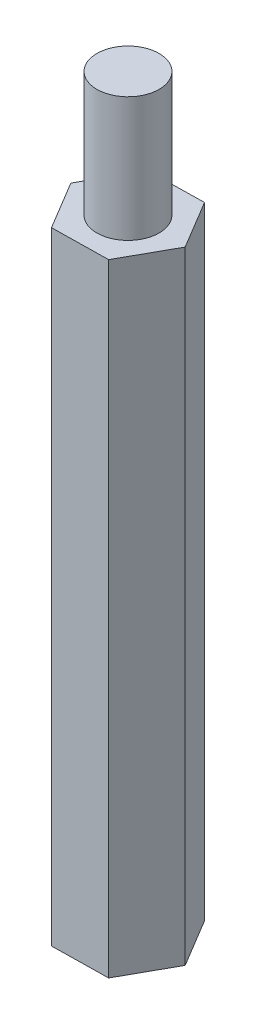
ISO-10303-21;
HEADER;
FILE_DESCRIPTION(('STEP AP214'),'2;1');
FILE_NAME('part.step','',(''),(''),'','','');
FILE_SCHEMA(('AUTOMOTIVE_DESIGN { 1 0 10303 214 1 1 1 1 }'));
ENDSEC;
DATA;
#1=APPLICATION_CONTEXT('core data for automotive mechanical design processes');
#2=APPLICATION_PROTOCOL_DEFINITION('international standard','automotive_design',2000,#1);
#3=PRODUCT_CONTEXT('',#1,'mechanical');
#4=PRODUCT('Part','Part','',(#3));
#5=PRODUCT_RELATED_PRODUCT_CATEGORY('part','',(#4));
#6=PRODUCT_DEFINITION_FORMATION('','',#4);
#7=PRODUCT_DEFINITION_CONTEXT('part definition',#1,'design');
#8=PRODUCT_DEFINITION('design','',#6,#7);
#9=PRODUCT_DEFINITION_SHAPE('','',#8);
#10=(LENGTH_UNIT() NAMED_UNIT(*) SI_UNIT(.MILLI.,.METRE.));
#11=(NAMED_UNIT(*) PLANE_ANGLE_UNIT() SI_UNIT($,.RADIAN.));
#12=(NAMED_UNIT(*) SI_UNIT($,.STERADIAN.) SOLID_ANGLE_UNIT());
#13=UNCERTAINTY_MEASURE_WITH_UNIT(LENGTH_MEASURE(1.E-05),#10,'distance_accuracy_value','');
#14=(GEOMETRIC_REPRESENTATION_CONTEXT(3) GLOBAL_UNCERTAINTY_ASSIGNED_CONTEXT((#13)) GLOBAL_UNIT_ASSIGNED_CONTEXT((#10,
#11,#12)) REPRESENTATION_CONTEXT('',''));
#15=CARTESIAN_POINT('',(0.,0.,0.));
#16=DIRECTION('',(0.,0.,1.));
#17=DIRECTION('',(1.,0.,0.));
#18=AXIS2_PLACEMENT_3D('',#15,#16,#17);
#19=CARTESIAN_POINT('',(0.,36.,0.));
#20=DIRECTION('',(0.,-1.,0.));
#21=DIRECTION('',(0.,0.,-1.));
#22=AXIS2_PLACEMENT_3D('',#19,#20,#21);
#23=CYLINDRICAL_SURFACE('',#22,1.5);
#24=CARTESIAN_POINT('',(0.,36.,0.));
#25=DIRECTION('',(0.,1.,0.));
#26=DIRECTION('',(0.,0.,1.));
#27=AXIS2_PLACEMENT_3D('',#24,#25,#26);
#28=CIRCLE('',#27,1.5);
#29=CARTESIAN_POINT('',(0.,36.,1.5));
#30=VERTEX_POINT('',#29);
#31=EDGE_CURVE('E11',#30,#30,#28,.T.);
#32=ORIENTED_EDGE('',*,*,#31,.F.);
#33=EDGE_LOOP('',(#32));
#34=FACE_BOUND('',#33,.T.);
#35=CARTESIAN_POINT('',(0.,30.,0.));
#36=DIRECTION('',(0.,1.,0.));
#37=DIRECTION('',(0.,0.,1.));
#38=AXIS2_PLACEMENT_3D('',#35,#36,#37);
#39=CIRCLE('',#38,1.5);
#40=CARTESIAN_POINT('',(0.,30.,1.5));
#41=VERTEX_POINT('',#40);
#42=EDGE_CURVE('E46',#41,#41,#39,.T.);
#43=ORIENTED_EDGE('',*,*,#42,.T.);
#44=EDGE_LOOP('',(#43));
#45=FACE_BOUND('',#44,.T.);
#46=ADVANCED_FACE('F43',(#34,#45),#23,.T.);
#47=CARTESIAN_POINT('',(0.,36.,0.));
#48=DIRECTION('',(0.,1.,0.));
#49=DIRECTION('',(0.,0.,1.));
#50=AXIS2_PLACEMENT_3D('',#47,#48,#49);
#51=PLANE('',#50);
#52=ORIENTED_EDGE('',*,*,#31,.T.);
#53=EDGE_LOOP('',(#52));
#54=FACE_BOUND('',#53,.T.);
#55=ADVANCED_FACE('F58',(#54),#51,.T.);
#56=CARTESIAN_POINT('',(0.,30.,0.));
#57=DIRECTION('',(0.,1.,0.));
#58=DIRECTION('',(0.,0.,1.));
#59=AXIS2_PLACEMENT_3D('',#56,#57,#58);
#60=PLANE('',#59);
#61=ORIENTED_EDGE('',*,*,#42,.F.);
#62=EDGE_LOOP('',(#61));
#63=FACE_BOUND('',#62,.T.);
#64=ADVANCED_FACE('F56',(#63),#60,.F.);
#65=CLOSED_SHELL('',(#46,#55,#64));
#66=MANIFOLD_SOLID_BREP('B2',#65);
#67=CARTESIAN_POINT('',(0.,30.,0.));
#68=DIRECTION('',(0.,1.,0.));
#69=DIRECTION('',(0.,0.,1.));
#70=AXIS2_PLACEMENT_3D('',#67,#68,#69);
#71=PLANE('',#70);
#72=DIRECTION('',(0.9998697085006,0.,-0.0161420575803037));
#73=VECTOR('',#72,1.);
#74=CARTESIAN_POINT('',(-1.31866252127611,30.,2.37159492500618));
#75=LINE('',#74,#73);
#76=CARTESIAN_POINT('',(-1.31866252127611,30.,2.37159492500618));
#77=VERTEX_POINT('',#76);
#78=CARTESIAN_POINT('',(1.39453019190354,30.,2.32779270494664));
#79=VERTEX_POINT('',#78);
#80=EDGE_CURVE('E180',#77,#79,#75,.T.);
#81=ORIENTED_EDGE('',*,*,#80,.T.);
#82=DIRECTION('',(0.485955422316405,0.,-0.873983596826213));
#83=VECTOR('',#82,1.);
#84=CARTESIAN_POINT('',(1.39453019190354,30.,2.32779270494664));
#85=LINE('',#84,#83);
#86=CARTESIAN_POINT('',(2.71319271317966,30.,-0.0438022200595355));
#87=VERTEX_POINT('',#86);
#88=EDGE_CURVE('E138',#79,#87,#85,.T.);
#89=ORIENTED_EDGE('',*,*,#88,.T.);
#90=DIRECTION('',(-0.513914286184194,0.,-0.857841539245909));
#91=VECTOR('',#90,1.);
#92=CARTESIAN_POINT('',(2.71319271317966,30.,-0.0438022200595355));
#93=LINE('',#92,#91);
#94=CARTESIAN_POINT('',(1.31866252127611,30.,-2.37159492500618));
#95=VERTEX_POINT('',#94);
#96=EDGE_CURVE('E151',#87,#95,#93,.T.);
#97=ORIENTED_EDGE('',*,*,#96,.T.);
#98=DIRECTION('',(-0.9998697085006,0.,0.0161420575803037));
#99=VECTOR('',#98,1.);
#100=CARTESIAN_POINT('',(1.31866252127611,30.,-2.37159492500618));
#101=LINE('',#100,#99);
#102=CARTESIAN_POINT('',(-1.39453019190354,30.,-2.32779270494664));
#103=VERTEX_POINT('',#102);
#104=EDGE_CURVE('E145',#95,#103,#101,.T.);
#105=ORIENTED_EDGE('',*,*,#104,.T.);
#106=DIRECTION('',(-0.485955422316406,0.,0.873983596826213));
#107=VECTOR('',#106,1.);
#108=CARTESIAN_POINT('',(-1.39453019190354,30.,-2.32779270494664));
#109=LINE('',#108,#107);
#110=CARTESIAN_POINT('',(-2.71319271317966,30.,0.043802220059535));
#111=VERTEX_POINT('',#110);
#112=EDGE_CURVE('E149',#103,#111,#109,.T.);
#113=ORIENTED_EDGE('',*,*,#112,.T.);
#114=DIRECTION('',(0.513914286184194,0.,0.857841539245909));
#115=VECTOR('',#114,1.);
#116=CARTESIAN_POINT('',(-2.71319271317966,30.,0.043802220059535));
#117=LINE('',#116,#115);
#118=EDGE_CURVE('E101',#111,#77,#117,.T.);
#119=ORIENTED_EDGE('',*,*,#118,.T.);
#120=EDGE_LOOP('',(#81,#89,#97,#105,#113,#119));
#121=FACE_BOUND('',#120,.T.);
#122=CARTESIAN_POINT('',(0.,30.,0.));
#123=DIRECTION('',(0.,1.,0.));
#124=DIRECTION('',(0.,0.,1.));
#125=AXIS2_PLACEMENT_3D('',#122,#123,#124);
#126=CIRCLE('',#125,1.5);
#127=CARTESIAN_POINT('',(0.,30.,1.5));
#128=VERTEX_POINT('',#127);
#129=EDGE_CURVE('E173',#128,#128,#126,.T.);
#130=ORIENTED_EDGE('',*,*,#129,.F.);
#131=EDGE_LOOP('',(#130));
#132=FACE_BOUND('',#131,.T.);
#133=ADVANCED_FACE('F84',(#121,#132),#71,.T.);
#134=CARTESIAN_POINT('',(0.,0.,0.));
#135=DIRECTION('',(0.,1.,0.));
#136=DIRECTION('',(0.,0.,1.));
#137=AXIS2_PLACEMENT_3D('',#134,#135,#136);
#138=PLANE('',#137);
#139=DIRECTION('',(0.9998697085006,0.,-0.0161420575803037));
#140=VECTOR('',#139,1.);
#141=CARTESIAN_POINT('',(-1.31866252127611,0.,2.37159492500618));
#142=LINE('',#141,#140);
#143=CARTESIAN_POINT('',(-1.31866252127611,0.,2.37159492500618));
#144=VERTEX_POINT('',#143);
#145=CARTESIAN_POINT('',(1.39453019190354,0.,2.32779270494664));
#146=VERTEX_POINT('',#145);
#147=EDGE_CURVE('E169',#144,#146,#142,.T.);
#148=ORIENTED_EDGE('',*,*,#147,.F.);
#149=DIRECTION('',(0.513914286184194,0.,0.857841539245909));
#150=VECTOR('',#149,1.);
#151=CARTESIAN_POINT('',(-2.71319271317966,0.,0.043802220059535));
#152=LINE('',#151,#150);
#153=CARTESIAN_POINT('',(-2.71319271317966,0.,0.043802220059535));
#154=VERTEX_POINT('',#153);
#155=EDGE_CURVE('E130',#154,#144,#152,.T.);
#156=ORIENTED_EDGE('',*,*,#155,.F.);
#157=DIRECTION('',(-0.485955422316406,0.,0.873983596826213));
#158=VECTOR('',#157,1.);
#159=CARTESIAN_POINT('',(-1.39453019190354,0.,-2.32779270494664));
#160=LINE('',#159,#158);
#161=CARTESIAN_POINT('',(-1.39453019190354,0.,-2.32779270494664));
#162=VERTEX_POINT('',#161);
#163=EDGE_CURVE('E124',#162,#154,#160,.T.);
#164=ORIENTED_EDGE('',*,*,#163,.F.);
#165=DIRECTION('',(-0.9998697085006,0.,0.0161420575803037));
#166=VECTOR('',#165,1.);
#167=CARTESIAN_POINT('',(1.31866252127611,0.,-2.37159492500618));
#168=LINE('',#167,#166);
#169=CARTESIAN_POINT('',(1.31866252127611,0.,-2.37159492500618));
#170=VERTEX_POINT('',#169);
#171=EDGE_CURVE('E159',#170,#162,#168,.T.);
#172=ORIENTED_EDGE('',*,*,#171,.F.);
#173=DIRECTION('',(-0.513914286184194,0.,-0.857841539245909));
#174=VECTOR('',#173,1.);
#175=CARTESIAN_POINT('',(2.71319271317966,0.,-0.0438022200595355));
#176=LINE('',#175,#174);
#177=CARTESIAN_POINT('',(2.71319271317966,0.,-0.0438022200595355));
#178=VERTEX_POINT('',#177);
#179=EDGE_CURVE('E175',#178,#170,#176,.T.);
#180=ORIENTED_EDGE('',*,*,#179,.F.);
#181=DIRECTION('',(0.485955422316405,0.,-0.873983596826213));
#182=VECTOR('',#181,1.);
#183=CARTESIAN_POINT('',(1.39453019190354,0.,2.32779270494664));
#184=LINE('',#183,#182);
#185=EDGE_CURVE('E172',#146,#178,#184,.T.);
#186=ORIENTED_EDGE('',*,*,#185,.F.);
#187=EDGE_LOOP('',(#148,#156,#164,#172,#180,#186));
#188=FACE_BOUND('',#187,.T.);
#189=CARTESIAN_POINT('',(0.,0.,0.));
#190=DIRECTION('',(0.,1.,0.));
#191=DIRECTION('',(0.,0.,1.));
#192=AXIS2_PLACEMENT_3D('',#189,#190,#191);
#193=CIRCLE('',#192,1.5);
#194=CARTESIAN_POINT('',(0.,0.,1.5));
#195=VERTEX_POINT('',#194);
#196=EDGE_CURVE('E273',#195,#195,#193,.T.);
#197=ORIENTED_EDGE('',*,*,#196,.T.);
#198=EDGE_LOOP('',(#197));
#199=FACE_BOUND('',#198,.T.);
#200=ADVANCED_FACE('F189',(#188,#199),#138,.F.);
#201=CARTESIAN_POINT('',(-1.31866252127611,30.,2.37159492500618));
#202=DIRECTION('',(-0.0161420575803037,0.,-0.9998697085006));
#203=DIRECTION('',(-0.9998697085006,0.,0.0161420575803037));
#204=AXIS2_PLACEMENT_3D('',#201,#202,#203);
#205=PLANE('',#204);
#206=ORIENTED_EDGE('',*,*,#147,.T.);
#207=DIRECTION('',(0.,-1.,0.));
#208=VECTOR('',#207,1.);
#209=CARTESIAN_POINT('',(1.39453019190354,30.,2.32779270494664));
#210=LINE('',#209,#208);
#211=EDGE_CURVE('E41',#79,#146,#210,.T.);
#212=ORIENTED_EDGE('',*,*,#211,.F.);
#213=ORIENTED_EDGE('',*,*,#80,.F.);
#214=DIRECTION('',(0.,-1.,0.));
#215=VECTOR('',#214,1.);
#216=CARTESIAN_POINT('',(-1.31866252127611,30.,2.37159492500618));
#217=LINE('',#216,#215);
#218=EDGE_CURVE('E165',#77,#144,#217,.T.);
#219=ORIENTED_EDGE('',*,*,#218,.T.);
#220=EDGE_LOOP('',(#206,#212,#213,#219));
#221=FACE_BOUND('',#220,.T.);
#222=ADVANCED_FACE('F86',(#221),#205,.F.);
#223=CARTESIAN_POINT('',(1.39453019190354,30.,2.32779270494664));
#224=DIRECTION('',(-0.873983596826213,0.,-0.485955422316405));
#225=DIRECTION('',(-0.485955422316406,0.,0.873983596826213));
#226=AXIS2_PLACEMENT_3D('',#223,#224,#225);
#227=PLANE('',#226);
#228=ORIENTED_EDGE('',*,*,#185,.T.);
#229=DIRECTION('',(0.,-1.,0.));
#230=VECTOR('',#229,1.);
#231=CARTESIAN_POINT('',(2.71319271317966,30.,-0.0438022200595355));
#232=LINE('',#231,#230);
#233=EDGE_CURVE('E93',#87,#178,#232,.T.);
#234=ORIENTED_EDGE('',*,*,#233,.F.);
#235=ORIENTED_EDGE('',*,*,#88,.F.);
#236=ORIENTED_EDGE('',*,*,#211,.T.);
#237=EDGE_LOOP('',(#228,#234,#235,#236));
#238=FACE_BOUND('',#237,.T.);
#239=ADVANCED_FACE('F214',(#238),#227,.F.);
#240=CARTESIAN_POINT('',(2.71319271317966,30.,-0.0438022200595355));
#241=DIRECTION('',(-0.857841539245909,0.,0.513914286184194));
#242=DIRECTION('',(0.513914286184194,0.,0.857841539245909));
#243=AXIS2_PLACEMENT_3D('',#240,#241,#242);
#244=PLANE('',#243);
#245=ORIENTED_EDGE('',*,*,#179,.T.);
#246=DIRECTION('',(0.,-1.,0.));
#247=VECTOR('',#246,1.);
#248=CARTESIAN_POINT('',(1.31866252127611,30.,-2.37159492500618));
#249=LINE('',#248,#247);
#250=EDGE_CURVE('E160',#95,#170,#249,.T.);
#251=ORIENTED_EDGE('',*,*,#250,.F.);
#252=ORIENTED_EDGE('',*,*,#96,.F.);
#253=ORIENTED_EDGE('',*,*,#233,.T.);
#254=EDGE_LOOP('',(#245,#251,#252,#253));
#255=FACE_BOUND('',#254,.T.);
#256=ADVANCED_FACE('F186',(#255),#244,.F.);
#257=CARTESIAN_POINT('',(1.31866252127611,30.,-2.37159492500618));
#258=DIRECTION('',(0.0161420575803037,0.,0.9998697085006));
#259=DIRECTION('',(0.9998697085006,0.,-0.0161420575803038));
#260=AXIS2_PLACEMENT_3D('',#257,#258,#259);
#261=PLANE('',#260);
#262=ORIENTED_EDGE('',*,*,#171,.T.);
#263=DIRECTION('',(0.,-1.,0.));
#264=VECTOR('',#263,1.);
#265=CARTESIAN_POINT('',(-1.39453019190354,30.,-2.32779270494664));
#266=LINE('',#265,#264);
#267=EDGE_CURVE('E156',#103,#162,#266,.T.);
#268=ORIENTED_EDGE('',*,*,#267,.F.);
#269=ORIENTED_EDGE('',*,*,#104,.F.);
#270=ORIENTED_EDGE('',*,*,#250,.T.);
#271=EDGE_LOOP('',(#262,#268,#269,#270));
#272=FACE_BOUND('',#271,.T.);
#273=ADVANCED_FACE('F157',(#272),#261,.F.);
#274=CARTESIAN_POINT('',(-1.39453019190354,30.,-2.32779270494664));
#275=DIRECTION('',(0.873983596826213,0.,0.485955422316406));
#276=DIRECTION('',(0.485955422316406,0.,-0.873983596826213));
#277=AXIS2_PLACEMENT_3D('',#274,#275,#276);
#278=PLANE('',#277);
#279=ORIENTED_EDGE('',*,*,#163,.T.);
#280=DIRECTION('',(0.,-1.,0.));
#281=VECTOR('',#280,1.);
#282=CARTESIAN_POINT('',(-2.71319271317966,30.,0.043802220059535));
#283=LINE('',#282,#281);
#284=EDGE_CURVE('E161',#111,#154,#283,.T.);
#285=ORIENTED_EDGE('',*,*,#284,.F.);
#286=ORIENTED_EDGE('',*,*,#112,.F.);
#287=ORIENTED_EDGE('',*,*,#267,.T.);
#288=EDGE_LOOP('',(#279,#285,#286,#287));
#289=FACE_BOUND('',#288,.T.);
#290=ADVANCED_FACE('F163',(#289),#278,.F.);
#291=CARTESIAN_POINT('',(-2.71319271317966,30.,0.043802220059535));
#292=DIRECTION('',(0.857841539245909,0.,-0.513914286184194));
#293=DIRECTION('',(-0.513914286184194,0.,-0.857841539245909));
#294=AXIS2_PLACEMENT_3D('',#291,#292,#293);
#295=PLANE('',#294);
#296=ORIENTED_EDGE('',*,*,#155,.T.);
#297=ORIENTED_EDGE('',*,*,#218,.F.);
#298=ORIENTED_EDGE('',*,*,#118,.F.);
#299=ORIENTED_EDGE('',*,*,#284,.T.);
#300=EDGE_LOOP('',(#296,#297,#298,#299));
#301=FACE_BOUND('',#300,.T.);
#302=ADVANCED_FACE('F194',(#301),#295,.F.);
#303=CARTESIAN_POINT('',(0.,30.,0.));
#304=DIRECTION('',(0.,-1.,0.));
#305=DIRECTION('',(0.,0.,-1.));
#306=AXIS2_PLACEMENT_3D('',#303,#304,#305);
#307=CYLINDRICAL_SURFACE('',#306,1.5);
#308=ORIENTED_EDGE('',*,*,#129,.T.);
#309=EDGE_LOOP('',(#308));
#310=FACE_BOUND('',#309,.T.);
#311=ORIENTED_EDGE('',*,*,#196,.F.);
#312=EDGE_LOOP('',(#311));
#313=FACE_BOUND('',#312,.T.);
#314=ADVANCED_FACE('F196',(#310,#313),#307,.F.);
#315=CLOSED_SHELL('',(#133,#200,#222,#239,#256,#273,#290,#302,#314));
#316=MANIFOLD_SOLID_BREP('B6',#315);
#317=ADVANCED_BREP_SHAPE_REPRESENTATION('',(#18,#66,#316),#14);
#318=SHAPE_DEFINITION_REPRESENTATION(#9,#317);
ENDSEC;
END-ISO-10303-21;
